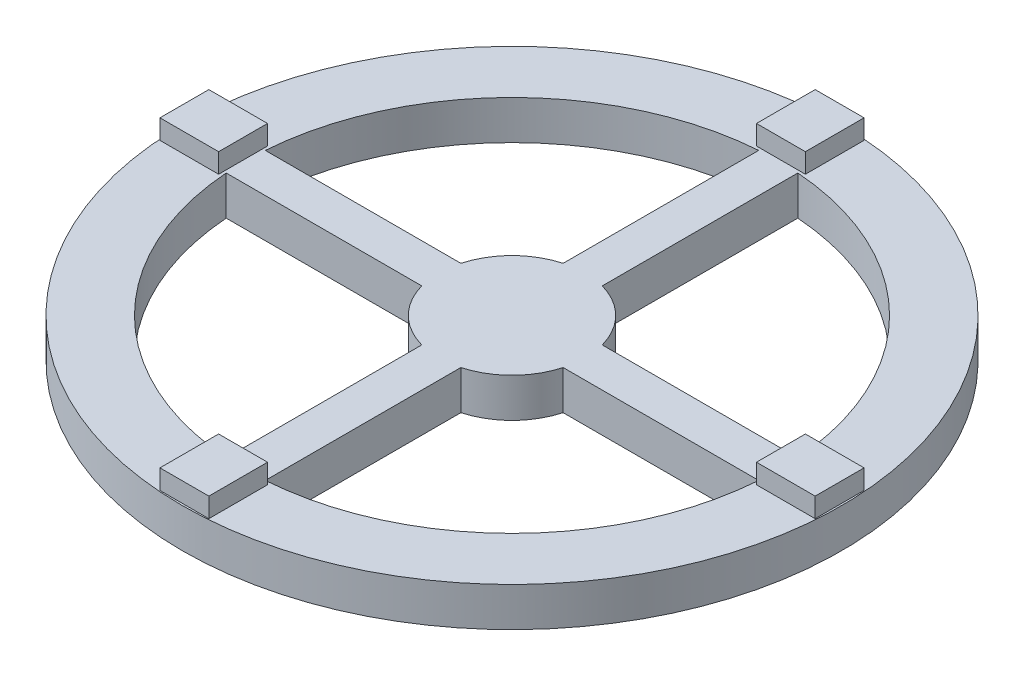
ISO-10303-21;
HEADER;
FILE_DESCRIPTION(('STEP AP214'),'2;1');
FILE_NAME('part.step','',(''),(''),'','','');
FILE_SCHEMA(('AUTOMOTIVE_DESIGN { 1 0 10303 214 1 1 1 1 }'));
ENDSEC;
DATA;
#1=APPLICATION_CONTEXT('core data for automotive mechanical design processes');
#2=APPLICATION_PROTOCOL_DEFINITION('international standard','automotive_design',2000,#1);
#3=PRODUCT_CONTEXT('',#1,'mechanical');
#4=PRODUCT('Part','Part','',(#3));
#5=PRODUCT_RELATED_PRODUCT_CATEGORY('part','',(#4));
#6=PRODUCT_DEFINITION_FORMATION('','',#4);
#7=PRODUCT_DEFINITION_CONTEXT('part definition',#1,'design');
#8=PRODUCT_DEFINITION('design','',#6,#7);
#9=PRODUCT_DEFINITION_SHAPE('','',#8);
#10=(LENGTH_UNIT() NAMED_UNIT(*) SI_UNIT(.MILLI.,.METRE.));
#11=(NAMED_UNIT(*) PLANE_ANGLE_UNIT() SI_UNIT($,.RADIAN.));
#12=(NAMED_UNIT(*) SI_UNIT($,.STERADIAN.) SOLID_ANGLE_UNIT());
#13=UNCERTAINTY_MEASURE_WITH_UNIT(LENGTH_MEASURE(1.E-05),#10,'distance_accuracy_value','');
#14=(GEOMETRIC_REPRESENTATION_CONTEXT(3) GLOBAL_UNCERTAINTY_ASSIGNED_CONTEXT((#13)) GLOBAL_UNIT_ASSIGNED_CONTEXT((#10,
#11,#12)) REPRESENTATION_CONTEXT('',''));
#15=CARTESIAN_POINT('',(0.,0.,0.));
#16=DIRECTION('',(0.,0.,1.));
#17=DIRECTION('',(1.,0.,0.));
#18=AXIS2_PLACEMENT_3D('',#15,#16,#17);
#19=CARTESIAN_POINT('',(-20.,20.,75.));
#20=DIRECTION('',(0.,1.,0.));
#21=DIRECTION('',(0.,0.,1.));
#22=AXIS2_PLACEMENT_3D('',#19,#20,#21);
#23=PLANE('',#22);
#24=CARTESIAN_POINT('',(0.,20.,0.));
#25=DIRECTION('',(0.,1.,0.));
#26=DIRECTION('',(0.,0.,1.));
#27=AXIS2_PLACEMENT_3D('',#24,#25,#26);
#28=CIRCLE('',#27,75.0000000000002);
#29=CARTESIAN_POINT('',(-72.2841614740051,20.,19.9999999999997));
#30=VERTEX_POINT('',#29);
#31=CARTESIAN_POINT('',(-20.,20.,72.284161474005));
#32=VERTEX_POINT('',#31);
#33=EDGE_CURVE('E371',#30,#32,#28,.T.);
#34=ORIENTED_EDGE('',*,*,#33,.T.);
#35=DIRECTION('',(0.,0.,1.));
#36=VECTOR('',#35,1.);
#37=CARTESIAN_POINT('',(-20.,20.,75.));
#38=LINE('',#37,#36);
#39=CARTESIAN_POINT('',(-20.,20.,272.266413646634));
#40=VERTEX_POINT('',#39);
#41=EDGE_CURVE('E480',#32,#40,#38,.T.);
#42=ORIENTED_EDGE('',*,*,#41,.T.);
#43=CARTESIAN_POINT('',(0.,20.,0.));
#44=DIRECTION('',(0.,1.,0.));
#45=DIRECTION('',(0.,0.,1.));
#46=AXIS2_PLACEMENT_3D('',#43,#44,#45);
#47=CIRCLE('',#46,273.);
#48=CARTESIAN_POINT('',(-272.266413646634,20.,19.9999999999991));
#49=VERTEX_POINT('',#48);
#50=EDGE_CURVE('E414',#49,#40,#47,.T.);
#51=ORIENTED_EDGE('',*,*,#50,.F.);
#52=DIRECTION('',(-1.,0.,0.));
#53=VECTOR('',#52,1.);
#54=CARTESIAN_POINT('',(-75.,20.,19.9999999999998));
#55=LINE('',#54,#53);
#56=EDGE_CURVE('E459',#30,#49,#55,.T.);
#57=ORIENTED_EDGE('',*,*,#56,.F.);
#58=EDGE_LOOP('',(#34,#42,#51,#57));
#59=FACE_BOUND('',#58,.T.);
#60=CARTESIAN_POINT('',(0.,20.,0.));
#61=DIRECTION('',(0.,1.,0.));
#62=DIRECTION('',(0.,0.,1.));
#63=AXIS2_PLACEMENT_3D('',#60,#61,#62);
#64=CIRCLE('',#63,75.0000000000002);
#65=CARTESIAN_POINT('',(20.,20.,72.284161474005));
#66=VERTEX_POINT('',#65);
#67=CARTESIAN_POINT('',(72.2841614740048,20.,20.0000000000008));
#68=VERTEX_POINT('',#67);
#69=EDGE_CURVE('E361',#66,#68,#64,.T.);
#70=ORIENTED_EDGE('',*,*,#69,.T.);
#71=DIRECTION('',(1.,0.,0.));
#72=VECTOR('',#71,1.);
#73=CARTESIAN_POINT('',(74.9999999999998,20.,20.0000000000008));
#74=LINE('',#73,#72);
#75=CARTESIAN_POINT('',(272.266413646634,20.,20.0000000000029));
#76=VERTEX_POINT('',#75);
#77=EDGE_CURVE('E452',#68,#76,#74,.T.);
#78=ORIENTED_EDGE('',*,*,#77,.T.);
#79=CARTESIAN_POINT('',(20.,20.,272.266413646634));
#80=VERTEX_POINT('',#79);
#81=EDGE_CURVE('E409',#80,#76,#47,.T.);
#82=ORIENTED_EDGE('',*,*,#81,.F.);
#83=DIRECTION('',(0.,0.,1.));
#84=VECTOR('',#83,1.);
#85=CARTESIAN_POINT('',(20.,20.,75.));
#86=LINE('',#85,#84);
#87=EDGE_CURVE('E469',#66,#80,#86,.T.);
#88=ORIENTED_EDGE('',*,*,#87,.F.);
#89=EDGE_LOOP('',(#70,#78,#82,#88));
#90=FACE_BOUND('',#89,.T.);
#91=CARTESIAN_POINT('',(0.,20.,0.));
#92=DIRECTION('',(0.,1.,0.));
#93=DIRECTION('',(0.,0.,1.));
#94=AXIS2_PLACEMENT_3D('',#91,#92,#93);
#95=CIRCLE('',#94,75.0000000000002);
#96=CARTESIAN_POINT('',(72.2841614740052,20.,-19.9999999999993));
#97=VERTEX_POINT('',#96);
#98=CARTESIAN_POINT('',(20.0000000000005,20.,-72.2841614740049));
#99=VERTEX_POINT('',#98);
#100=EDGE_CURVE('E364',#97,#99,#95,.T.);
#101=ORIENTED_EDGE('',*,*,#100,.T.);
#102=DIRECTION('',(0.,0.,-1.));
#103=VECTOR('',#102,1.);
#104=CARTESIAN_POINT('',(20.,20.,-75.));
#105=LINE('',#104,#103);
#106=CARTESIAN_POINT('',(20.,20.,-272.266413646634));
#107=VERTEX_POINT('',#106);
#108=EDGE_CURVE('E462',#99,#107,#105,.T.);
#109=ORIENTED_EDGE('',*,*,#108,.T.);
#110=CARTESIAN_POINT('',(272.266413646634,20.,-19.9999999999972));
#111=VERTEX_POINT('',#110);
#112=EDGE_CURVE('E413',#111,#107,#47,.T.);
#113=ORIENTED_EDGE('',*,*,#112,.F.);
#114=DIRECTION('',(1.,0.,0.));
#115=VECTOR('',#114,1.);
#116=CARTESIAN_POINT('',(75.0000000000002,20.,-19.9999999999992));
#117=LINE('',#116,#115);
#118=EDGE_CURVE('E445',#97,#111,#117,.T.);
#119=ORIENTED_EDGE('',*,*,#118,.F.);
#120=EDGE_LOOP('',(#101,#109,#113,#119));
#121=FACE_BOUND('',#120,.T.);
#122=DIRECTION('',(0.,0.,-1.));
#123=VECTOR('',#122,1.);
#124=CARTESIAN_POINT('',(-20.,20.,-75.));
#125=LINE('',#124,#123);
#126=CARTESIAN_POINT('',(-19.9999999999995,20.,-72.2841614740052));
#127=VERTEX_POINT('',#126);
#128=CARTESIAN_POINT('',(-20.,20.,-272.266413646634));
#129=VERTEX_POINT('',#128);
#130=EDGE_CURVE('E449',#127,#129,#125,.T.);
#131=ORIENTED_EDGE('',*,*,#130,.F.);
#132=CARTESIAN_POINT('',(0.,20.,0.));
#133=DIRECTION('',(0.,1.,0.));
#134=DIRECTION('',(0.,0.,1.));
#135=AXIS2_PLACEMENT_3D('',#132,#133,#134);
#136=CIRCLE('',#135,75.0000000000002);
#137=CARTESIAN_POINT('',(-72.284161474005,20.,-20.0000000000003));
#138=VERTEX_POINT('',#137);
#139=EDGE_CURVE('E368',#127,#138,#136,.T.);
#140=ORIENTED_EDGE('',*,*,#139,.T.);
#141=DIRECTION('',(-1.,0.,0.));
#142=VECTOR('',#141,1.);
#143=CARTESIAN_POINT('',(-74.9999999999999,20.,-20.0000000000003));
#144=LINE('',#143,#142);
#145=CARTESIAN_POINT('',(-272.266413646634,20.,-20.000000000001));
#146=VERTEX_POINT('',#145);
#147=EDGE_CURVE('E472',#138,#146,#144,.T.);
#148=ORIENTED_EDGE('',*,*,#147,.T.);
#149=EDGE_CURVE('E563',#129,#146,#47,.T.);
#150=ORIENTED_EDGE('',*,*,#149,.F.);
#151=EDGE_LOOP('',(#131,#140,#148,#150));
#152=FACE_BOUND('',#151,.T.);
#153=CARTESIAN_POINT('',(0.,20.,0.));
#154=DIRECTION('',(0.,1.,0.));
#155=DIRECTION('',(0.,0.,1.));
#156=AXIS2_PLACEMENT_3D('',#153,#154,#155);
#157=CIRCLE('',#156,337.);
#158=CARTESIAN_POINT('',(0.,20.,337.));
#159=VERTEX_POINT('',#158);
#160=EDGE_CURVE('E419',#159,#159,#157,.T.);
#161=ORIENTED_EDGE('',*,*,#160,.T.);
#162=EDGE_LOOP('',(#161));
#163=FACE_BOUND('',#162,.T.);
#164=DIRECTION('',(-1.,0.,0.));
#165=VECTOR('',#164,1.);
#166=CARTESIAN_POINT('',(275.,20.,-24.9999999999999));
#167=LINE('',#166,#165);
#168=CARTESIAN_POINT('',(335.,20.,-24.9999999999999));
#169=VERTEX_POINT('',#168);
#170=CARTESIAN_POINT('',(275.,20.,-24.9999999999999));
#171=VERTEX_POINT('',#170);
#172=EDGE_CURVE('E345',#169,#171,#167,.T.);
#173=ORIENTED_EDGE('',*,*,#172,.F.);
#174=DIRECTION('',(0.,0.,-1.));
#175=VECTOR('',#174,1.);
#176=CARTESIAN_POINT('',(335.,20.,25.0000000000001));
#177=LINE('',#176,#175);
#178=CARTESIAN_POINT('',(335.,20.,25.0000000000001));
#179=VERTEX_POINT('',#178);
#180=EDGE_CURVE('E331',#179,#169,#177,.T.);
#181=ORIENTED_EDGE('',*,*,#180,.F.);
#182=DIRECTION('',(1.,0.,0.));
#183=VECTOR('',#182,1.);
#184=CARTESIAN_POINT('',(275.,20.,25.0000000000001));
#185=LINE('',#184,#183);
#186=CARTESIAN_POINT('',(275.,20.,25.0000000000001));
#187=VERTEX_POINT('',#186);
#188=EDGE_CURVE('E336',#187,#179,#185,.T.);
#189=ORIENTED_EDGE('',*,*,#188,.F.);
#190=DIRECTION('',(0.,0.,1.));
#191=VECTOR('',#190,1.);
#192=CARTESIAN_POINT('',(275.,20.,25.0000000000001));
#193=LINE('',#192,#191);
#194=EDGE_CURVE('E347',#171,#187,#193,.T.);
#195=ORIENTED_EDGE('',*,*,#194,.F.);
#196=EDGE_LOOP('',(#173,#181,#189,#195));
#197=FACE_BOUND('',#196,.T.);
#198=DIRECTION('',(-1.,0.,0.));
#199=VECTOR('',#198,1.);
#200=CARTESIAN_POINT('',(-25.,20.,275.));
#201=LINE('',#200,#199);
#202=CARTESIAN_POINT('',(25.,20.,275.));
#203=VERTEX_POINT('',#202);
#204=CARTESIAN_POINT('',(-25.,20.,275.));
#205=VERTEX_POINT('',#204);
#206=EDGE_CURVE('E316',#203,#205,#201,.T.);
#207=ORIENTED_EDGE('',*,*,#206,.F.);
#208=DIRECTION('',(0.,0.,-1.));
#209=VECTOR('',#208,1.);
#210=CARTESIAN_POINT('',(25.,20.,275.));
#211=LINE('',#210,#209);
#212=CARTESIAN_POINT('',(25.,20.,335.));
#213=VERTEX_POINT('',#212);
#214=EDGE_CURVE('E302',#213,#203,#211,.T.);
#215=ORIENTED_EDGE('',*,*,#214,.F.);
#216=DIRECTION('',(1.,0.,0.));
#217=VECTOR('',#216,1.);
#218=CARTESIAN_POINT('',(-25.,20.,335.));
#219=LINE('',#218,#217);
#220=CARTESIAN_POINT('',(-25.,20.,335.));
#221=VERTEX_POINT('',#220);
#222=EDGE_CURVE('E307',#221,#213,#219,.T.);
#223=ORIENTED_EDGE('',*,*,#222,.F.);
#224=DIRECTION('',(0.,0.,1.));
#225=VECTOR('',#224,1.);
#226=CARTESIAN_POINT('',(-25.,20.,275.));
#227=LINE('',#226,#225);
#228=EDGE_CURVE('E318',#205,#221,#227,.T.);
#229=ORIENTED_EDGE('',*,*,#228,.F.);
#230=EDGE_LOOP('',(#207,#215,#223,#229));
#231=FACE_BOUND('',#230,.T.);
#232=DIRECTION('',(0.,0.,-1.));
#233=VECTOR('',#232,1.);
#234=CARTESIAN_POINT('',(-275.,20.,-25.));
#235=LINE('',#234,#233);
#236=CARTESIAN_POINT('',(-275.,20.,25.));
#237=VERTEX_POINT('',#236);
#238=CARTESIAN_POINT('',(-275.,20.,-25.));
#239=VERTEX_POINT('',#238);
#240=EDGE_CURVE('E274',#237,#239,#235,.T.);
#241=ORIENTED_EDGE('',*,*,#240,.F.);
#242=DIRECTION('',(1.,0.,0.));
#243=VECTOR('',#242,1.);
#244=CARTESIAN_POINT('',(-275.,20.,25.));
#245=LINE('',#244,#243);
#246=CARTESIAN_POINT('',(-335.,20.,25.0000000000001));
#247=VERTEX_POINT('',#246);
#248=EDGE_CURVE('E271',#247,#237,#245,.T.);
#249=ORIENTED_EDGE('',*,*,#248,.F.);
#250=DIRECTION('',(0.,0.,1.));
#251=VECTOR('',#250,1.);
#252=CARTESIAN_POINT('',(-335.,20.,-24.9999999999999));
#253=LINE('',#252,#251);
#254=CARTESIAN_POINT('',(-335.,20.,-24.9999999999999));
#255=VERTEX_POINT('',#254);
#256=EDGE_CURVE('E283',#255,#247,#253,.T.);
#257=ORIENTED_EDGE('',*,*,#256,.F.);
#258=DIRECTION('',(-1.,0.,0.));
#259=VECTOR('',#258,1.);
#260=CARTESIAN_POINT('',(-275.,20.,-25.));
#261=LINE('',#260,#259);
#262=EDGE_CURVE('E291',#239,#255,#261,.T.);
#263=ORIENTED_EDGE('',*,*,#262,.F.);
#264=EDGE_LOOP('',(#241,#249,#257,#263));
#265=FACE_BOUND('',#264,.T.);
#266=DIRECTION('',(1.,0.,0.));
#267=VECTOR('',#266,1.);
#268=CARTESIAN_POINT('',(25.0000000000001,20.,-275.));
#269=LINE('',#268,#267);
#270=CARTESIAN_POINT('',(-25.,20.,-275.));
#271=VERTEX_POINT('',#270);
#272=CARTESIAN_POINT('',(25.0000000000001,20.,-275.));
#273=VERTEX_POINT('',#272);
#274=EDGE_CURVE('E605',#271,#273,#269,.T.);
#275=ORIENTED_EDGE('',*,*,#274,.F.);
#276=DIRECTION('',(0.,0.,1.));
#277=VECTOR('',#276,1.);
#278=CARTESIAN_POINT('',(-25.,20.,-275.));
#279=LINE('',#278,#277);
#280=CARTESIAN_POINT('',(-25.0000000000001,20.,-335.));
#281=VERTEX_POINT('',#280);
#282=EDGE_CURVE('E269',#281,#271,#279,.T.);
#283=ORIENTED_EDGE('',*,*,#282,.F.);
#284=DIRECTION('',(-1.,0.,0.));
#285=VECTOR('',#284,1.);
#286=CARTESIAN_POINT('',(25.,20.,-335.));
#287=LINE('',#286,#285);
#288=CARTESIAN_POINT('',(25.,20.,-335.));
#289=VERTEX_POINT('',#288);
#290=EDGE_CURVE('E265',#289,#281,#287,.T.);
#291=ORIENTED_EDGE('',*,*,#290,.F.);
#292=DIRECTION('',(0.,0.,-1.));
#293=VECTOR('',#292,1.);
#294=CARTESIAN_POINT('',(25.0000000000001,20.,-275.));
#295=LINE('',#294,#293);
#296=EDGE_CURVE('E607',#273,#289,#295,.T.);
#297=ORIENTED_EDGE('',*,*,#296,.F.);
#298=EDGE_LOOP('',(#275,#283,#291,#297));
#299=FACE_BOUND('',#298,.T.);
#300=ADVANCED_FACE('F36',(#59,#90,#121,#152,#163,#197,#231,#265,#299),#23,.T.);
#301=CARTESIAN_POINT('',(-20.,-20.,75.));
#302=DIRECTION('',(0.,-1.,0.));
#303=DIRECTION('',(0.,0.,-1.));
#304=AXIS2_PLACEMENT_3D('',#301,#302,#303);
#305=PLANE('',#304);
#306=CARTESIAN_POINT('',(0.,-20.,0.));
#307=DIRECTION('',(0.,1.,0.));
#308=DIRECTION('',(0.,0.,1.));
#309=AXIS2_PLACEMENT_3D('',#306,#307,#308);
#310=CIRCLE('',#309,75.0000000000002);
#311=CARTESIAN_POINT('',(20.,-20.,72.284161474005));
#312=VERTEX_POINT('',#311);
#313=CARTESIAN_POINT('',(72.2841614740048,-20.,20.0000000000008));
#314=VERTEX_POINT('',#313);
#315=EDGE_CURVE('E360',#312,#314,#310,.T.);
#316=ORIENTED_EDGE('',*,*,#315,.F.);
#317=DIRECTION('',(0.,0.,1.));
#318=VECTOR('',#317,1.);
#319=CARTESIAN_POINT('',(20.,-20.,75.));
#320=LINE('',#319,#318);
#321=CARTESIAN_POINT('',(20.,-20.,272.266413646634));
#322=VERTEX_POINT('',#321);
#323=EDGE_CURVE('E44',#312,#322,#320,.T.);
#324=ORIENTED_EDGE('',*,*,#323,.T.);
#325=CARTESIAN_POINT('',(0.,-20.,0.));
#326=DIRECTION('',(0.,1.,0.));
#327=DIRECTION('',(0.,0.,1.));
#328=AXIS2_PLACEMENT_3D('',#325,#326,#327);
#329=CIRCLE('',#328,273.);
#330=CARTESIAN_POINT('',(272.266413646634,-20.,20.0000000000029));
#331=VERTEX_POINT('',#330);
#332=EDGE_CURVE('E415',#322,#331,#329,.T.);
#333=ORIENTED_EDGE('',*,*,#332,.T.);
#334=DIRECTION('',(1.,0.,0.));
#335=VECTOR('',#334,1.);
#336=CARTESIAN_POINT('',(74.9999999999998,-20.,20.0000000000008));
#337=LINE('',#336,#335);
#338=EDGE_CURVE('E450',#314,#331,#337,.T.);
#339=ORIENTED_EDGE('',*,*,#338,.F.);
#340=EDGE_LOOP('',(#316,#324,#333,#339));
#341=FACE_BOUND('',#340,.T.);
#342=CARTESIAN_POINT('',(0.,-20.,0.));
#343=DIRECTION('',(0.,1.,0.));
#344=DIRECTION('',(0.,0.,1.));
#345=AXIS2_PLACEMENT_3D('',#342,#343,#344);
#346=CIRCLE('',#345,75.0000000000002);
#347=CARTESIAN_POINT('',(72.2841614740052,-20.,-19.9999999999993));
#348=VERTEX_POINT('',#347);
#349=CARTESIAN_POINT('',(20.0000000000005,-20.,-72.2841614740049));
#350=VERTEX_POINT('',#349);
#351=EDGE_CURVE('E377',#348,#350,#346,.T.);
#352=ORIENTED_EDGE('',*,*,#351,.F.);
#353=DIRECTION('',(1.,0.,0.));
#354=VECTOR('',#353,1.);
#355=CARTESIAN_POINT('',(75.0000000000002,-20.,-19.9999999999992));
#356=LINE('',#355,#354);
#357=CARTESIAN_POINT('',(272.266413646634,-20.,-19.9999999999972));
#358=VERTEX_POINT('',#357);
#359=EDGE_CURVE('E446',#348,#358,#356,.T.);
#360=ORIENTED_EDGE('',*,*,#359,.T.);
#361=CARTESIAN_POINT('',(20.,-20.,-272.266413646634));
#362=VERTEX_POINT('',#361);
#363=EDGE_CURVE('E418',#358,#362,#329,.T.);
#364=ORIENTED_EDGE('',*,*,#363,.T.);
#365=DIRECTION('',(0.,0.,-1.));
#366=VECTOR('',#365,1.);
#367=CARTESIAN_POINT('',(20.,-20.,-75.));
#368=LINE('',#367,#366);
#369=EDGE_CURVE('E460',#350,#362,#368,.T.);
#370=ORIENTED_EDGE('',*,*,#369,.F.);
#371=EDGE_LOOP('',(#352,#360,#364,#370));
#372=FACE_BOUND('',#371,.T.);
#373=CARTESIAN_POINT('',(0.,-20.,0.));
#374=DIRECTION('',(0.,1.,0.));
#375=DIRECTION('',(0.,0.,1.));
#376=AXIS2_PLACEMENT_3D('',#373,#374,#375);
#377=CIRCLE('',#376,75.0000000000002);
#378=CARTESIAN_POINT('',(-19.9999999999995,-20.,-72.2841614740052));
#379=VERTEX_POINT('',#378);
#380=CARTESIAN_POINT('',(-72.284161474005,-20.,-20.0000000000003));
#381=VERTEX_POINT('',#380);
#382=EDGE_CURVE('E380',#379,#381,#377,.T.);
#383=ORIENTED_EDGE('',*,*,#382,.F.);
#384=DIRECTION('',(0.,0.,-1.));
#385=VECTOR('',#384,1.);
#386=CARTESIAN_POINT('',(-20.,-20.,-75.));
#387=LINE('',#386,#385);
#388=CARTESIAN_POINT('',(-20.,-20.,-272.266413646634));
#389=VERTEX_POINT('',#388);
#390=EDGE_CURVE('E456',#379,#389,#387,.T.);
#391=ORIENTED_EDGE('',*,*,#390,.T.);
#392=CARTESIAN_POINT('',(-272.266413646634,-20.,-20.000000000001));
#393=VERTEX_POINT('',#392);
#394=EDGE_CURVE('E579',#389,#393,#329,.T.);
#395=ORIENTED_EDGE('',*,*,#394,.T.);
#396=DIRECTION('',(-1.,0.,0.));
#397=VECTOR('',#396,1.);
#398=CARTESIAN_POINT('',(-74.9999999999999,-20.,-20.0000000000003));
#399=LINE('',#398,#397);
#400=EDGE_CURVE('E470',#381,#393,#399,.T.);
#401=ORIENTED_EDGE('',*,*,#400,.F.);
#402=EDGE_LOOP('',(#383,#391,#395,#401));
#403=FACE_BOUND('',#402,.T.);
#404=CARTESIAN_POINT('',(-272.266413646634,-20.,19.9999999999991));
#405=VERTEX_POINT('',#404);
#406=CARTESIAN_POINT('',(-20.,-20.,272.266413646634));
#407=VERTEX_POINT('',#406);
#408=EDGE_CURVE('E408',#405,#407,#329,.T.);
#409=ORIENTED_EDGE('',*,*,#408,.T.);
#410=DIRECTION('',(0.,0.,1.));
#411=VECTOR('',#410,1.);
#412=CARTESIAN_POINT('',(-20.,-20.,75.));
#413=LINE('',#412,#411);
#414=CARTESIAN_POINT('',(-20.,-20.,72.284161474005));
#415=VERTEX_POINT('',#414);
#416=EDGE_CURVE('E478',#415,#407,#413,.T.);
#417=ORIENTED_EDGE('',*,*,#416,.F.);
#418=CARTESIAN_POINT('',(0.,-20.,0.));
#419=DIRECTION('',(0.,1.,0.));
#420=DIRECTION('',(0.,0.,1.));
#421=AXIS2_PLACEMENT_3D('',#418,#419,#420);
#422=CIRCLE('',#421,75.0000000000002);
#423=CARTESIAN_POINT('',(-72.2841614740051,-20.,19.9999999999997));
#424=VERTEX_POINT('',#423);
#425=EDGE_CURVE('E365',#424,#415,#422,.T.);
#426=ORIENTED_EDGE('',*,*,#425,.F.);
#427=DIRECTION('',(-1.,0.,0.));
#428=VECTOR('',#427,1.);
#429=CARTESIAN_POINT('',(-75.,-20.,19.9999999999998));
#430=LINE('',#429,#428);
#431=EDGE_CURVE('E466',#424,#405,#430,.T.);
#432=ORIENTED_EDGE('',*,*,#431,.T.);
#433=EDGE_LOOP('',(#409,#417,#426,#432));
#434=FACE_BOUND('',#433,.T.);
#435=CARTESIAN_POINT('',(0.,-20.,0.));
#436=DIRECTION('',(0.,1.,0.));
#437=DIRECTION('',(0.,0.,1.));
#438=AXIS2_PLACEMENT_3D('',#435,#436,#437);
#439=CIRCLE('',#438,337.);
#440=CARTESIAN_POINT('',(0.,-20.,337.));
#441=VERTEX_POINT('',#440);
#442=EDGE_CURVE('E412',#441,#441,#439,.T.);
#443=ORIENTED_EDGE('',*,*,#442,.F.);
#444=EDGE_LOOP('',(#443));
#445=FACE_BOUND('',#444,.T.);
#446=ADVANCED_FACE('F496',(#341,#372,#403,#434,#445),#305,.T.);
#447=CARTESIAN_POINT('',(20.,-20.,75.));
#448=DIRECTION('',(1.,0.,0.));
#449=DIRECTION('',(0.,0.,-1.));
#450=AXIS2_PLACEMENT_3D('',#447,#448,#449);
#451=PLANE('',#450);
#452=DIRECTION('',(0.,-1.,0.));
#453=VECTOR('',#452,1.);
#454=CARTESIAN_POINT('',(20.,20.,272.266413646634));
#455=LINE('',#454,#453);
#456=EDGE_CURVE('E442',#322,#80,#455,.F.);
#457=ORIENTED_EDGE('',*,*,#456,.F.);
#458=ORIENTED_EDGE('',*,*,#323,.F.);
#459=DIRECTION('',(0.,-1.,0.));
#460=VECTOR('',#459,1.);
#461=CARTESIAN_POINT('',(20.,20.,72.284161474005));
#462=LINE('',#461,#460);
#463=EDGE_CURVE('E405',#66,#312,#462,.T.);
#464=ORIENTED_EDGE('',*,*,#463,.F.);
#465=ORIENTED_EDGE('',*,*,#87,.T.);
#466=EDGE_LOOP('',(#457,#458,#464,#465));
#467=FACE_BOUND('',#466,.T.);
#468=ADVANCED_FACE('F38',(#467),#451,.T.);
#469=CARTESIAN_POINT('',(-20.,-20.,75.));
#470=DIRECTION('',(-1.,0.,0.));
#471=DIRECTION('',(0.,0.,1.));
#472=AXIS2_PLACEMENT_3D('',#469,#470,#471);
#473=PLANE('',#472);
#474=DIRECTION('',(0.,-1.,0.));
#475=VECTOR('',#474,1.);
#476=CARTESIAN_POINT('',(-20.,20.,272.266413646634));
#477=LINE('',#476,#475);
#478=EDGE_CURVE('E439',#40,#407,#477,.T.);
#479=ORIENTED_EDGE('',*,*,#478,.F.);
#480=ORIENTED_EDGE('',*,*,#41,.F.);
#481=DIRECTION('',(0.,-1.,0.));
#482=VECTOR('',#481,1.);
#483=CARTESIAN_POINT('',(-20.,20.,72.284161474005));
#484=LINE('',#483,#482);
#485=EDGE_CURVE('E374',#32,#415,#484,.T.);
#486=ORIENTED_EDGE('',*,*,#485,.T.);
#487=ORIENTED_EDGE('',*,*,#416,.T.);
#488=EDGE_LOOP('',(#479,#480,#486,#487));
#489=FACE_BOUND('',#488,.T.);
#490=ADVANCED_FACE('F522',(#489),#473,.T.);
#491=CARTESIAN_POINT('',(0.,20.,0.));
#492=DIRECTION('',(0.,-1.,0.));
#493=DIRECTION('',(0.,0.,-1.));
#494=AXIS2_PLACEMENT_3D('',#491,#492,#493);
#495=CYLINDRICAL_SURFACE('',#494,273.);
#496=ORIENTED_EDGE('',*,*,#332,.F.);
#497=ORIENTED_EDGE('',*,*,#456,.T.);
#498=ORIENTED_EDGE('',*,*,#81,.T.);
#499=DIRECTION('',(0.,-1.,0.));
#500=VECTOR('',#499,1.);
#501=CARTESIAN_POINT('',(272.266413646634,20.,20.0000000000029));
#502=LINE('',#501,#500);
#503=EDGE_CURVE('E11',#76,#331,#502,.T.);
#504=ORIENTED_EDGE('',*,*,#503,.T.);
#505=EDGE_LOOP('',(#496,#497,#498,#504));
#506=FACE_BOUND('',#505,.T.);
#507=ADVANCED_FACE('F489',(#506),#495,.F.);
#508=ORIENTED_EDGE('',*,*,#50,.T.);
#509=ORIENTED_EDGE('',*,*,#478,.T.);
#510=ORIENTED_EDGE('',*,*,#408,.F.);
#511=DIRECTION('',(0.,-1.,0.));
#512=VECTOR('',#511,1.);
#513=CARTESIAN_POINT('',(-272.266413646634,20.,19.9999999999991));
#514=LINE('',#513,#512);
#515=EDGE_CURVE('E436',#405,#49,#514,.F.);
#516=ORIENTED_EDGE('',*,*,#515,.T.);
#517=EDGE_LOOP('',(#508,#509,#510,#516));
#518=FACE_BOUND('',#517,.T.);
#519=ADVANCED_FACE('F554',(#518),#495,.F.);
#520=ORIENTED_EDGE('',*,*,#149,.T.);
#521=DIRECTION('',(0.,-1.,0.));
#522=VECTOR('',#521,1.);
#523=CARTESIAN_POINT('',(-272.266413646634,20.,-20.000000000001));
#524=LINE('',#523,#522);
#525=EDGE_CURVE('E433',#146,#393,#524,.T.);
#526=ORIENTED_EDGE('',*,*,#525,.T.);
#527=ORIENTED_EDGE('',*,*,#394,.F.);
#528=DIRECTION('',(0.,-1.,0.));
#529=VECTOR('',#528,1.);
#530=CARTESIAN_POINT('',(-20.,20.,-272.266413646634));
#531=LINE('',#530,#529);
#532=EDGE_CURVE('E430',#389,#129,#531,.F.);
#533=ORIENTED_EDGE('',*,*,#532,.T.);
#534=EDGE_LOOP('',(#520,#526,#527,#533));
#535=FACE_BOUND('',#534,.T.);
#536=ADVANCED_FACE('F546',(#535),#495,.F.);
#537=CARTESIAN_POINT('',(0.,20.,0.));
#538=DIRECTION('',(0.,-1.,0.));
#539=DIRECTION('',(0.,0.,-1.));
#540=AXIS2_PLACEMENT_3D('',#537,#538,#539);
#541=CYLINDRICAL_SURFACE('',#540,337.);
#542=ORIENTED_EDGE('',*,*,#160,.F.);
#543=EDGE_LOOP('',(#542));
#544=FACE_BOUND('',#543,.T.);
#545=ORIENTED_EDGE('',*,*,#442,.T.);
#546=EDGE_LOOP('',(#545));
#547=FACE_BOUND('',#546,.T.);
#548=ADVANCED_FACE('F544',(#544,#547),#541,.T.);
#549=ORIENTED_EDGE('',*,*,#112,.T.);
#550=DIRECTION('',(0.,-1.,0.));
#551=VECTOR('',#550,1.);
#552=CARTESIAN_POINT('',(20.,20.,-272.266413646634));
#553=LINE('',#552,#551);
#554=EDGE_CURVE('E427',#107,#362,#553,.T.);
#555=ORIENTED_EDGE('',*,*,#554,.T.);
#556=ORIENTED_EDGE('',*,*,#363,.F.);
#557=DIRECTION('',(0.,-1.,0.));
#558=VECTOR('',#557,1.);
#559=CARTESIAN_POINT('',(272.266413646634,20.,-19.9999999999972));
#560=LINE('',#559,#558);
#561=EDGE_CURVE('E422',#358,#111,#560,.F.);
#562=ORIENTED_EDGE('',*,*,#561,.T.);
#563=EDGE_LOOP('',(#549,#555,#556,#562));
#564=FACE_BOUND('',#563,.T.);
#565=ADVANCED_FACE('F543',(#564),#495,.F.);
#566=CARTESIAN_POINT('',(74.9999999999998,-20.,20.0000000000008));
#567=DIRECTION('',(0.,0.,1.));
#568=DIRECTION('',(1.,0.,0.));
#569=AXIS2_PLACEMENT_3D('',#566,#567,#568);
#570=PLANE('',#569);
#571=ORIENTED_EDGE('',*,*,#503,.F.);
#572=ORIENTED_EDGE('',*,*,#77,.F.);
#573=DIRECTION('',(0.,-1.,0.));
#574=VECTOR('',#573,1.);
#575=CARTESIAN_POINT('',(72.2841614740048,20.,20.0000000000008));
#576=LINE('',#575,#574);
#577=EDGE_CURVE('E402',#68,#314,#576,.T.);
#578=ORIENTED_EDGE('',*,*,#577,.T.);
#579=ORIENTED_EDGE('',*,*,#338,.T.);
#580=EDGE_LOOP('',(#571,#572,#578,#579));
#581=FACE_BOUND('',#580,.T.);
#582=ADVANCED_FACE('F493',(#581),#570,.T.);
#583=CARTESIAN_POINT('',(75.0000000000002,-20.,-19.9999999999992));
#584=DIRECTION('',(0.,0.,-1.));
#585=DIRECTION('',(-1.,0.,0.));
#586=AXIS2_PLACEMENT_3D('',#583,#584,#585);
#587=PLANE('',#586);
#588=ORIENTED_EDGE('',*,*,#561,.F.);
#589=ORIENTED_EDGE('',*,*,#359,.F.);
#590=DIRECTION('',(0.,-1.,0.));
#591=VECTOR('',#590,1.);
#592=CARTESIAN_POINT('',(72.2841614740052,20.,-19.9999999999993));
#593=LINE('',#592,#591);
#594=EDGE_CURVE('E399',#97,#348,#593,.T.);
#595=ORIENTED_EDGE('',*,*,#594,.F.);
#596=ORIENTED_EDGE('',*,*,#118,.T.);
#597=EDGE_LOOP('',(#588,#589,#595,#596));
#598=FACE_BOUND('',#597,.T.);
#599=ADVANCED_FACE('F536',(#598),#587,.T.);
#600=CARTESIAN_POINT('',(20.,-20.,-75.));
#601=DIRECTION('',(1.,0.,0.));
#602=DIRECTION('',(0.,0.,-1.));
#603=AXIS2_PLACEMENT_3D('',#600,#601,#602);
#604=PLANE('',#603);
#605=ORIENTED_EDGE('',*,*,#554,.F.);
#606=ORIENTED_EDGE('',*,*,#108,.F.);
#607=DIRECTION('',(0.,-1.,0.));
#608=VECTOR('',#607,1.);
#609=CARTESIAN_POINT('',(20.0000000000005,20.,-72.2841614740049));
#610=LINE('',#609,#608);
#611=EDGE_CURVE('E396',#99,#350,#610,.T.);
#612=ORIENTED_EDGE('',*,*,#611,.T.);
#613=ORIENTED_EDGE('',*,*,#369,.T.);
#614=EDGE_LOOP('',(#605,#606,#612,#613));
#615=FACE_BOUND('',#614,.T.);
#616=ADVANCED_FACE('F532',(#615),#604,.T.);
#617=CARTESIAN_POINT('',(-20.,-20.,-75.));
#618=DIRECTION('',(-1.,0.,0.));
#619=DIRECTION('',(0.,0.,1.));
#620=AXIS2_PLACEMENT_3D('',#617,#618,#619);
#621=PLANE('',#620);
#622=ORIENTED_EDGE('',*,*,#532,.F.);
#623=ORIENTED_EDGE('',*,*,#390,.F.);
#624=DIRECTION('',(0.,-1.,0.));
#625=VECTOR('',#624,1.);
#626=CARTESIAN_POINT('',(-19.9999999999995,20.,-72.2841614740052));
#627=LINE('',#626,#625);
#628=EDGE_CURVE('E393',#127,#379,#627,.T.);
#629=ORIENTED_EDGE('',*,*,#628,.F.);
#630=ORIENTED_EDGE('',*,*,#130,.T.);
#631=EDGE_LOOP('',(#622,#623,#629,#630));
#632=FACE_BOUND('',#631,.T.);
#633=ADVANCED_FACE('F527',(#632),#621,.T.);
#634=CARTESIAN_POINT('',(-75.,-20.,19.9999999999998));
#635=DIRECTION('',(0.,0.,1.));
#636=DIRECTION('',(1.,0.,0.));
#637=AXIS2_PLACEMENT_3D('',#634,#635,#636);
#638=PLANE('',#637);
#639=ORIENTED_EDGE('',*,*,#515,.F.);
#640=ORIENTED_EDGE('',*,*,#431,.F.);
#641=DIRECTION('',(0.,-1.,0.));
#642=VECTOR('',#641,1.);
#643=CARTESIAN_POINT('',(-72.2841614740051,20.,19.9999999999997));
#644=LINE('',#643,#642);
#645=EDGE_CURVE('E387',#30,#424,#644,.T.);
#646=ORIENTED_EDGE('',*,*,#645,.F.);
#647=ORIENTED_EDGE('',*,*,#56,.T.);
#648=EDGE_LOOP('',(#639,#640,#646,#647));
#649=FACE_BOUND('',#648,.T.);
#650=ADVANCED_FACE('F511',(#649),#638,.T.);
#651=CARTESIAN_POINT('',(-74.9999999999999,-20.,-20.0000000000003));
#652=DIRECTION('',(0.,0.,-1.));
#653=DIRECTION('',(-1.,0.,0.));
#654=AXIS2_PLACEMENT_3D('',#651,#652,#653);
#655=PLANE('',#654);
#656=ORIENTED_EDGE('',*,*,#525,.F.);
#657=ORIENTED_EDGE('',*,*,#147,.F.);
#658=DIRECTION('',(0.,-1.,0.));
#659=VECTOR('',#658,1.);
#660=CARTESIAN_POINT('',(-72.284161474005,20.,-20.0000000000003));
#661=LINE('',#660,#659);
#662=EDGE_CURVE('E390',#138,#381,#661,.T.);
#663=ORIENTED_EDGE('',*,*,#662,.T.);
#664=ORIENTED_EDGE('',*,*,#400,.T.);
#665=EDGE_LOOP('',(#656,#657,#663,#664));
#666=FACE_BOUND('',#665,.T.);
#667=ADVANCED_FACE('F502',(#666),#655,.T.);
#668=CARTESIAN_POINT('',(0.,20.,0.));
#669=DIRECTION('',(0.,-1.,0.));
#670=DIRECTION('',(0.,0.,-1.));
#671=AXIS2_PLACEMENT_3D('',#668,#669,#670);
#672=CYLINDRICAL_SURFACE('',#671,75.0000000000002);
#673=ORIENTED_EDGE('',*,*,#315,.T.);
#674=ORIENTED_EDGE('',*,*,#577,.F.);
#675=ORIENTED_EDGE('',*,*,#69,.F.);
#676=ORIENTED_EDGE('',*,*,#463,.T.);
#677=EDGE_LOOP('',(#673,#674,#675,#676));
#678=FACE_BOUND('',#677,.T.);
#679=ADVANCED_FACE('F499',(#678),#672,.T.);
#680=CARTESIAN_POINT('',(0.,20.,0.));
#681=DIRECTION('',(0.,-1.,0.));
#682=DIRECTION('',(0.,0.,-1.));
#683=AXIS2_PLACEMENT_3D('',#680,#681,#682);
#684=CYLINDRICAL_SURFACE('',#683,75.0000000000002);
#685=ORIENTED_EDGE('',*,*,#351,.T.);
#686=ORIENTED_EDGE('',*,*,#611,.F.);
#687=ORIENTED_EDGE('',*,*,#100,.F.);
#688=ORIENTED_EDGE('',*,*,#594,.T.);
#689=EDGE_LOOP('',(#685,#686,#687,#688));
#690=FACE_BOUND('',#689,.T.);
#691=ADVANCED_FACE('F501',(#690),#684,.T.);
#692=CARTESIAN_POINT('',(0.,20.,0.));
#693=DIRECTION('',(0.,-1.,0.));
#694=DIRECTION('',(0.,0.,-1.));
#695=AXIS2_PLACEMENT_3D('',#692,#693,#694);
#696=CYLINDRICAL_SURFACE('',#695,75.0000000000002);
#697=ORIENTED_EDGE('',*,*,#382,.T.);
#698=ORIENTED_EDGE('',*,*,#662,.F.);
#699=ORIENTED_EDGE('',*,*,#139,.F.);
#700=ORIENTED_EDGE('',*,*,#628,.T.);
#701=EDGE_LOOP('',(#697,#698,#699,#700));
#702=FACE_BOUND('',#701,.T.);
#703=ADVANCED_FACE('F508',(#702),#696,.T.);
#704=CARTESIAN_POINT('',(0.,20.,0.));
#705=DIRECTION('',(0.,-1.,0.));
#706=DIRECTION('',(0.,0.,-1.));
#707=AXIS2_PLACEMENT_3D('',#704,#705,#706);
#708=CYLINDRICAL_SURFACE('',#707,75.0000000000002);
#709=ORIENTED_EDGE('',*,*,#425,.T.);
#710=ORIENTED_EDGE('',*,*,#485,.F.);
#711=ORIENTED_EDGE('',*,*,#33,.F.);
#712=ORIENTED_EDGE('',*,*,#645,.T.);
#713=EDGE_LOOP('',(#709,#710,#711,#712));
#714=FACE_BOUND('',#713,.T.);
#715=ADVANCED_FACE('F578',(#714),#708,.T.);
#716=CARTESIAN_POINT('',(335.,40.,25.0000000000001));
#717=DIRECTION('',(-1.,0.,0.));
#718=DIRECTION('',(0.,0.,1.));
#719=AXIS2_PLACEMENT_3D('',#716,#717,#718);
#720=PLANE('',#719);
#721=ORIENTED_EDGE('',*,*,#180,.T.);
#722=DIRECTION('',(0.,-1.,0.));
#723=VECTOR('',#722,1.);
#724=CARTESIAN_POINT('',(335.,40.,-24.9999999999999));
#725=LINE('',#724,#723);
#726=CARTESIAN_POINT('',(335.,40.,-24.9999999999999));
#727=VERTEX_POINT('',#726);
#728=EDGE_CURVE('E358',#727,#169,#725,.T.);
#729=ORIENTED_EDGE('',*,*,#728,.F.);
#730=DIRECTION('',(0.,0.,-1.));
#731=VECTOR('',#730,1.);
#732=CARTESIAN_POINT('',(335.,40.,25.0000000000001));
#733=LINE('',#732,#731);
#734=CARTESIAN_POINT('',(335.,40.,25.0000000000001));
#735=VERTEX_POINT('',#734);
#736=EDGE_CURVE('E332',#735,#727,#733,.T.);
#737=ORIENTED_EDGE('',*,*,#736,.F.);
#738=DIRECTION('',(0.,-1.,0.));
#739=VECTOR('',#738,1.);
#740=CARTESIAN_POINT('',(335.,40.,25.0000000000001));
#741=LINE('',#740,#739);
#742=EDGE_CURVE('E342',#735,#179,#741,.T.);
#743=ORIENTED_EDGE('',*,*,#742,.T.);
#744=EDGE_LOOP('',(#721,#729,#737,#743));
#745=FACE_BOUND('',#744,.T.);
#746=ADVANCED_FACE('F686',(#745),#720,.F.);
#747=CARTESIAN_POINT('',(275.,40.,-24.9999999999999));
#748=DIRECTION('',(0.,0.,1.));
#749=DIRECTION('',(1.,0.,0.));
#750=AXIS2_PLACEMENT_3D('',#747,#748,#749);
#751=PLANE('',#750);
#752=ORIENTED_EDGE('',*,*,#172,.T.);
#753=DIRECTION('',(0.,-1.,0.));
#754=VECTOR('',#753,1.);
#755=CARTESIAN_POINT('',(275.,40.,-24.9999999999999));
#756=LINE('',#755,#754);
#757=CARTESIAN_POINT('',(275.,40.,-24.9999999999999));
#758=VERTEX_POINT('',#757);
#759=EDGE_CURVE('E355',#758,#171,#756,.T.);
#760=ORIENTED_EDGE('',*,*,#759,.F.);
#761=DIRECTION('',(-1.,0.,0.));
#762=VECTOR('',#761,1.);
#763=CARTESIAN_POINT('',(275.,40.,-24.9999999999999));
#764=LINE('',#763,#762);
#765=EDGE_CURVE('E335',#727,#758,#764,.T.);
#766=ORIENTED_EDGE('',*,*,#765,.F.);
#767=ORIENTED_EDGE('',*,*,#728,.T.);
#768=EDGE_LOOP('',(#752,#760,#766,#767));
#769=FACE_BOUND('',#768,.T.);
#770=ADVANCED_FACE('F682',(#769),#751,.F.);
#771=CARTESIAN_POINT('',(275.,40.,25.0000000000001));
#772=DIRECTION('',(1.,0.,0.));
#773=DIRECTION('',(0.,0.,-1.));
#774=AXIS2_PLACEMENT_3D('',#771,#772,#773);
#775=PLANE('',#774);
#776=ORIENTED_EDGE('',*,*,#194,.T.);
#777=DIRECTION('',(0.,-1.,0.));
#778=VECTOR('',#777,1.);
#779=CARTESIAN_POINT('',(275.,40.,25.0000000000001));
#780=LINE('',#779,#778);
#781=CARTESIAN_POINT('',(275.,40.,25.0000000000001));
#782=VERTEX_POINT('',#781);
#783=EDGE_CURVE('E353',#782,#187,#780,.T.);
#784=ORIENTED_EDGE('',*,*,#783,.F.);
#785=DIRECTION('',(0.,0.,1.));
#786=VECTOR('',#785,1.);
#787=CARTESIAN_POINT('',(275.,40.,25.0000000000001));
#788=LINE('',#787,#786);
#789=EDGE_CURVE('E338',#758,#782,#788,.T.);
#790=ORIENTED_EDGE('',*,*,#789,.F.);
#791=ORIENTED_EDGE('',*,*,#759,.T.);
#792=EDGE_LOOP('',(#776,#784,#790,#791));
#793=FACE_BOUND('',#792,.T.);
#794=ADVANCED_FACE('F678',(#793),#775,.F.);
#795=CARTESIAN_POINT('',(275.,40.,25.0000000000001));
#796=DIRECTION('',(0.,0.,-1.));
#797=DIRECTION('',(-1.,0.,0.));
#798=AXIS2_PLACEMENT_3D('',#795,#796,#797);
#799=PLANE('',#798);
#800=ORIENTED_EDGE('',*,*,#188,.T.);
#801=ORIENTED_EDGE('',*,*,#742,.F.);
#802=DIRECTION('',(1.,0.,0.));
#803=VECTOR('',#802,1.);
#804=CARTESIAN_POINT('',(275.,40.,25.0000000000001));
#805=LINE('',#804,#803);
#806=EDGE_CURVE('E340',#782,#735,#805,.T.);
#807=ORIENTED_EDGE('',*,*,#806,.F.);
#808=ORIENTED_EDGE('',*,*,#783,.T.);
#809=EDGE_LOOP('',(#800,#801,#807,#808));
#810=FACE_BOUND('',#809,.T.);
#811=ADVANCED_FACE('F674',(#810),#799,.F.);
#812=CARTESIAN_POINT('',(0.,40.,0.));
#813=DIRECTION('',(0.,-1.,0.));
#814=DIRECTION('',(0.,0.,-1.));
#815=AXIS2_PLACEMENT_3D('',#812,#813,#814);
#816=PLANE('',#815);
#817=ORIENTED_EDGE('',*,*,#736,.T.);
#818=ORIENTED_EDGE('',*,*,#765,.T.);
#819=ORIENTED_EDGE('',*,*,#789,.T.);
#820=ORIENTED_EDGE('',*,*,#806,.T.);
#821=EDGE_LOOP('',(#817,#818,#819,#820));
#822=FACE_BOUND('',#821,.T.);
#823=ADVANCED_FACE('F670',(#822),#816,.F.);
#824=CARTESIAN_POINT('',(25.,40.,275.));
#825=DIRECTION('',(-1.,0.,0.));
#826=DIRECTION('',(0.,0.,1.));
#827=AXIS2_PLACEMENT_3D('',#824,#825,#826);
#828=PLANE('',#827);
#829=ORIENTED_EDGE('',*,*,#214,.T.);
#830=DIRECTION('',(0.,-1.,0.));
#831=VECTOR('',#830,1.);
#832=CARTESIAN_POINT('',(25.,40.,275.));
#833=LINE('',#832,#831);
#834=CARTESIAN_POINT('',(25.,40.,275.));
#835=VERTEX_POINT('',#834);
#836=EDGE_CURVE('E329',#835,#203,#833,.T.);
#837=ORIENTED_EDGE('',*,*,#836,.F.);
#838=DIRECTION('',(0.,0.,-1.));
#839=VECTOR('',#838,1.);
#840=CARTESIAN_POINT('',(25.,40.,275.));
#841=LINE('',#840,#839);
#842=CARTESIAN_POINT('',(25.,40.,335.));
#843=VERTEX_POINT('',#842);
#844=EDGE_CURVE('E303',#843,#835,#841,.T.);
#845=ORIENTED_EDGE('',*,*,#844,.F.);
#846=DIRECTION('',(0.,-1.,0.));
#847=VECTOR('',#846,1.);
#848=CARTESIAN_POINT('',(25.,40.,335.));
#849=LINE('',#848,#847);
#850=EDGE_CURVE('E313',#843,#213,#849,.T.);
#851=ORIENTED_EDGE('',*,*,#850,.T.);
#852=EDGE_LOOP('',(#829,#837,#845,#851));
#853=FACE_BOUND('',#852,.T.);
#854=ADVANCED_FACE('F666',(#853),#828,.F.);
#855=CARTESIAN_POINT('',(-25.,40.,275.));
#856=DIRECTION('',(0.,0.,1.));
#857=DIRECTION('',(1.,0.,0.));
#858=AXIS2_PLACEMENT_3D('',#855,#856,#857);
#859=PLANE('',#858);
#860=ORIENTED_EDGE('',*,*,#206,.T.);
#861=DIRECTION('',(0.,-1.,0.));
#862=VECTOR('',#861,1.);
#863=CARTESIAN_POINT('',(-25.,40.,275.));
#864=LINE('',#863,#862);
#865=CARTESIAN_POINT('',(-25.,40.,275.));
#866=VERTEX_POINT('',#865);
#867=EDGE_CURVE('E326',#866,#205,#864,.T.);
#868=ORIENTED_EDGE('',*,*,#867,.F.);
#869=DIRECTION('',(-1.,0.,0.));
#870=VECTOR('',#869,1.);
#871=CARTESIAN_POINT('',(-25.,40.,275.));
#872=LINE('',#871,#870);
#873=EDGE_CURVE('E306',#835,#866,#872,.T.);
#874=ORIENTED_EDGE('',*,*,#873,.F.);
#875=ORIENTED_EDGE('',*,*,#836,.T.);
#876=EDGE_LOOP('',(#860,#868,#874,#875));
#877=FACE_BOUND('',#876,.T.);
#878=ADVANCED_FACE('F662',(#877),#859,.F.);
#879=CARTESIAN_POINT('',(-25.,40.,275.));
#880=DIRECTION('',(1.,0.,0.));
#881=DIRECTION('',(0.,0.,-1.));
#882=AXIS2_PLACEMENT_3D('',#879,#880,#881);
#883=PLANE('',#882);
#884=ORIENTED_EDGE('',*,*,#228,.T.);
#885=DIRECTION('',(0.,-1.,0.));
#886=VECTOR('',#885,1.);
#887=CARTESIAN_POINT('',(-25.,40.,335.));
#888=LINE('',#887,#886);
#889=CARTESIAN_POINT('',(-25.,40.,335.));
#890=VERTEX_POINT('',#889);
#891=EDGE_CURVE('E324',#890,#221,#888,.T.);
#892=ORIENTED_EDGE('',*,*,#891,.F.);
#893=DIRECTION('',(0.,0.,1.));
#894=VECTOR('',#893,1.);
#895=CARTESIAN_POINT('',(-25.,40.,275.));
#896=LINE('',#895,#894);
#897=EDGE_CURVE('E309',#866,#890,#896,.T.);
#898=ORIENTED_EDGE('',*,*,#897,.F.);
#899=ORIENTED_EDGE('',*,*,#867,.T.);
#900=EDGE_LOOP('',(#884,#892,#898,#899));
#901=FACE_BOUND('',#900,.T.);
#902=ADVANCED_FACE('F658',(#901),#883,.F.);
#903=CARTESIAN_POINT('',(-25.,40.,335.));
#904=DIRECTION('',(0.,0.,-1.));
#905=DIRECTION('',(-1.,0.,0.));
#906=AXIS2_PLACEMENT_3D('',#903,#904,#905);
#907=PLANE('',#906);
#908=ORIENTED_EDGE('',*,*,#222,.T.);
#909=ORIENTED_EDGE('',*,*,#850,.F.);
#910=DIRECTION('',(1.,0.,0.));
#911=VECTOR('',#910,1.);
#912=CARTESIAN_POINT('',(-25.,40.,335.));
#913=LINE('',#912,#911);
#914=EDGE_CURVE('E311',#890,#843,#913,.T.);
#915=ORIENTED_EDGE('',*,*,#914,.F.);
#916=ORIENTED_EDGE('',*,*,#891,.T.);
#917=EDGE_LOOP('',(#908,#909,#915,#916));
#918=FACE_BOUND('',#917,.T.);
#919=ADVANCED_FACE('F654',(#918),#907,.F.);
#920=CARTESIAN_POINT('',(0.,40.,0.));
#921=DIRECTION('',(0.,1.,0.));
#922=DIRECTION('',(0.,0.,1.));
#923=AXIS2_PLACEMENT_3D('',#920,#921,#922);
#924=PLANE('',#923);
#925=ORIENTED_EDGE('',*,*,#844,.T.);
#926=ORIENTED_EDGE('',*,*,#873,.T.);
#927=ORIENTED_EDGE('',*,*,#897,.T.);
#928=ORIENTED_EDGE('',*,*,#914,.T.);
#929=EDGE_LOOP('',(#925,#926,#927,#928));
#930=FACE_BOUND('',#929,.T.);
#931=ADVANCED_FACE('F650',(#930),#924,.T.);
#932=CARTESIAN_POINT('',(-275.,40.,25.));
#933=DIRECTION('',(0.,0.,-1.));
#934=DIRECTION('',(-1.,0.,0.));
#935=AXIS2_PLACEMENT_3D('',#932,#933,#934);
#936=PLANE('',#935);
#937=ORIENTED_EDGE('',*,*,#248,.T.);
#938=DIRECTION('',(0.,-1.,0.));
#939=VECTOR('',#938,1.);
#940=CARTESIAN_POINT('',(-275.,40.,25.));
#941=LINE('',#940,#939);
#942=CARTESIAN_POINT('',(-275.,40.,25.));
#943=VERTEX_POINT('',#942);
#944=EDGE_CURVE('E300',#943,#237,#941,.T.);
#945=ORIENTED_EDGE('',*,*,#944,.F.);
#946=DIRECTION('',(1.,0.,0.));
#947=VECTOR('',#946,1.);
#948=CARTESIAN_POINT('',(-275.,40.,25.));
#949=LINE('',#948,#947);
#950=CARTESIAN_POINT('',(-335.,40.,25.0000000000001));
#951=VERTEX_POINT('',#950);
#952=EDGE_CURVE('E279',#951,#943,#949,.T.);
#953=ORIENTED_EDGE('',*,*,#952,.F.);
#954=DIRECTION('',(0.,-1.,0.));
#955=VECTOR('',#954,1.);
#956=CARTESIAN_POINT('',(-335.,40.,25.0000000000001));
#957=LINE('',#956,#955);
#958=EDGE_CURVE('E288',#951,#247,#957,.T.);
#959=ORIENTED_EDGE('',*,*,#958,.T.);
#960=EDGE_LOOP('',(#937,#945,#953,#959));
#961=FACE_BOUND('',#960,.T.);
#962=ADVANCED_FACE('F646',(#961),#936,.F.);
#963=CARTESIAN_POINT('',(-275.,40.,-25.));
#964=DIRECTION('',(-1.,0.,0.));
#965=DIRECTION('',(0.,0.,1.));
#966=AXIS2_PLACEMENT_3D('',#963,#964,#965);
#967=PLANE('',#966);
#968=ORIENTED_EDGE('',*,*,#240,.T.);
#969=DIRECTION('',(0.,-1.,0.));
#970=VECTOR('',#969,1.);
#971=CARTESIAN_POINT('',(-275.,40.,-25.));
#972=LINE('',#971,#970);
#973=CARTESIAN_POINT('',(-275.,40.,-25.));
#974=VERTEX_POINT('',#973);
#975=EDGE_CURVE('E297',#974,#239,#972,.T.);
#976=ORIENTED_EDGE('',*,*,#975,.F.);
#977=DIRECTION('',(0.,0.,-1.));
#978=VECTOR('',#977,1.);
#979=CARTESIAN_POINT('',(-275.,40.,-25.));
#980=LINE('',#979,#978);
#981=EDGE_CURVE('E282',#943,#974,#980,.T.);
#982=ORIENTED_EDGE('',*,*,#981,.F.);
#983=ORIENTED_EDGE('',*,*,#944,.T.);
#984=EDGE_LOOP('',(#968,#976,#982,#983));
#985=FACE_BOUND('',#984,.T.);
#986=ADVANCED_FACE('F642',(#985),#967,.F.);
#987=CARTESIAN_POINT('',(-275.,40.,-25.));
#988=DIRECTION('',(0.,0.,1.));
#989=DIRECTION('',(1.,0.,0.));
#990=AXIS2_PLACEMENT_3D('',#987,#988,#989);
#991=PLANE('',#990);
#992=ORIENTED_EDGE('',*,*,#262,.T.);
#993=DIRECTION('',(0.,-1.,0.));
#994=VECTOR('',#993,1.);
#995=CARTESIAN_POINT('',(-335.,40.,-24.9999999999999));
#996=LINE('',#995,#994);
#997=CARTESIAN_POINT('',(-335.,40.,-24.9999999999999));
#998=VERTEX_POINT('',#997);
#999=EDGE_CURVE('E59',#998,#255,#996,.T.);
#1000=ORIENTED_EDGE('',*,*,#999,.F.);
#1001=DIRECTION('',(-1.,0.,0.));
#1002=VECTOR('',#1001,1.);
#1003=CARTESIAN_POINT('',(-275.,40.,-25.));
#1004=LINE('',#1003,#1002);
#1005=EDGE_CURVE('E285',#974,#998,#1004,.T.);
#1006=ORIENTED_EDGE('',*,*,#1005,.F.);
#1007=ORIENTED_EDGE('',*,*,#975,.T.);
#1008=EDGE_LOOP('',(#992,#1000,#1006,#1007));
#1009=FACE_BOUND('',#1008,.T.);
#1010=ADVANCED_FACE('F639',(#1009),#991,.F.);
#1011=CARTESIAN_POINT('',(-335.,40.,-24.9999999999999));
#1012=DIRECTION('',(1.,0.,0.));
#1013=DIRECTION('',(0.,0.,-1.));
#1014=AXIS2_PLACEMENT_3D('',#1011,#1012,#1013);
#1015=PLANE('',#1014);
#1016=ORIENTED_EDGE('',*,*,#256,.T.);
#1017=ORIENTED_EDGE('',*,*,#958,.F.);
#1018=DIRECTION('',(0.,0.,1.));
#1019=VECTOR('',#1018,1.);
#1020=CARTESIAN_POINT('',(-335.,40.,-24.9999999999999));
#1021=LINE('',#1020,#1019);
#1022=EDGE_CURVE('E287',#998,#951,#1021,.T.);
#1023=ORIENTED_EDGE('',*,*,#1022,.F.);
#1024=ORIENTED_EDGE('',*,*,#999,.T.);
#1025=EDGE_LOOP('',(#1016,#1017,#1023,#1024));
#1026=FACE_BOUND('',#1025,.T.);
#1027=ADVANCED_FACE('F635',(#1026),#1015,.F.);
#1028=CARTESIAN_POINT('',(0.,40.,0.));
#1029=DIRECTION('',(0.,1.,0.));
#1030=DIRECTION('',(0.,0.,1.));
#1031=AXIS2_PLACEMENT_3D('',#1028,#1029,#1030);
#1032=PLANE('',#1031);
#1033=ORIENTED_EDGE('',*,*,#952,.T.);
#1034=ORIENTED_EDGE('',*,*,#981,.T.);
#1035=ORIENTED_EDGE('',*,*,#1005,.T.);
#1036=ORIENTED_EDGE('',*,*,#1022,.T.);
#1037=EDGE_LOOP('',(#1033,#1034,#1035,#1036));
#1038=FACE_BOUND('',#1037,.T.);
#1039=ADVANCED_FACE('F632',(#1038),#1032,.T.);
#1040=CARTESIAN_POINT('',(-25.,40.,-275.));
#1041=DIRECTION('',(1.,0.,0.));
#1042=DIRECTION('',(0.,0.,-1.));
#1043=AXIS2_PLACEMENT_3D('',#1040,#1041,#1042);
#1044=PLANE('',#1043);
#1045=ORIENTED_EDGE('',*,*,#282,.T.);
#1046=DIRECTION('',(0.,-1.,0.));
#1047=VECTOR('',#1046,1.);
#1048=CARTESIAN_POINT('',(-25.,40.,-275.));
#1049=LINE('',#1048,#1047);
#1050=CARTESIAN_POINT('',(-25.,40.,-275.));
#1051=VERTEX_POINT('',#1050);
#1052=EDGE_CURVE('E250',#1051,#271,#1049,.T.);
#1053=ORIENTED_EDGE('',*,*,#1052,.F.);
#1054=DIRECTION('',(0.,0.,1.));
#1055=VECTOR('',#1054,1.);
#1056=CARTESIAN_POINT('',(-25.,40.,-275.));
#1057=LINE('',#1056,#1055);
#1058=CARTESIAN_POINT('',(-25.0000000000001,40.,-335.));
#1059=VERTEX_POINT('',#1058);
#1060=EDGE_CURVE('E257',#1059,#1051,#1057,.T.);
#1061=ORIENTED_EDGE('',*,*,#1060,.F.);
#1062=DIRECTION('',(0.,-1.,0.));
#1063=VECTOR('',#1062,1.);
#1064=CARTESIAN_POINT('',(-25.0000000000001,40.,-335.));
#1065=LINE('',#1064,#1063);
#1066=EDGE_CURVE('E614',#1059,#281,#1065,.T.);
#1067=ORIENTED_EDGE('',*,*,#1066,.T.);
#1068=EDGE_LOOP('',(#1045,#1053,#1061,#1067));
#1069=FACE_BOUND('',#1068,.T.);
#1070=ADVANCED_FACE('F267',(#1069),#1044,.F.);
#1071=CARTESIAN_POINT('',(25.0000000000001,40.,-275.));
#1072=DIRECTION('',(0.,0.,-1.));
#1073=DIRECTION('',(-1.,0.,0.));
#1074=AXIS2_PLACEMENT_3D('',#1071,#1072,#1073);
#1075=PLANE('',#1074);
#1076=ORIENTED_EDGE('',*,*,#274,.T.);
#1077=DIRECTION('',(0.,-1.,0.));
#1078=VECTOR('',#1077,1.);
#1079=CARTESIAN_POINT('',(25.0000000000001,40.,-275.));
#1080=LINE('',#1079,#1078);
#1081=CARTESIAN_POINT('',(25.0000000000001,40.,-275.));
#1082=VERTEX_POINT('',#1081);
#1083=EDGE_CURVE('E253',#1082,#273,#1080,.T.);
#1084=ORIENTED_EDGE('',*,*,#1083,.F.);
#1085=DIRECTION('',(1.,0.,0.));
#1086=VECTOR('',#1085,1.);
#1087=CARTESIAN_POINT('',(25.0000000000001,40.,-275.));
#1088=LINE('',#1087,#1086);
#1089=EDGE_CURVE('E246',#1051,#1082,#1088,.T.);
#1090=ORIENTED_EDGE('',*,*,#1089,.F.);
#1091=ORIENTED_EDGE('',*,*,#1052,.T.);
#1092=EDGE_LOOP('',(#1076,#1084,#1090,#1091));
#1093=FACE_BOUND('',#1092,.T.);
#1094=ADVANCED_FACE('F248',(#1093),#1075,.F.);
#1095=CARTESIAN_POINT('',(25.0000000000001,40.,-275.));
#1096=DIRECTION('',(-1.,0.,0.));
#1097=DIRECTION('',(0.,0.,1.));
#1098=AXIS2_PLACEMENT_3D('',#1095,#1096,#1097);
#1099=PLANE('',#1098);
#1100=ORIENTED_EDGE('',*,*,#296,.T.);
#1101=DIRECTION('',(0.,-1.,0.));
#1102=VECTOR('',#1101,1.);
#1103=CARTESIAN_POINT('',(25.,40.,-335.));
#1104=LINE('',#1103,#1102);
#1105=CARTESIAN_POINT('',(25.,40.,-335.));
#1106=VERTEX_POINT('',#1105);
#1107=EDGE_CURVE('E51',#1106,#289,#1104,.T.);
#1108=ORIENTED_EDGE('',*,*,#1107,.F.);
#1109=DIRECTION('',(0.,0.,-1.));
#1110=VECTOR('',#1109,1.);
#1111=CARTESIAN_POINT('',(25.0000000000001,40.,-275.));
#1112=LINE('',#1111,#1110);
#1113=EDGE_CURVE('E256',#1082,#1106,#1112,.T.);
#1114=ORIENTED_EDGE('',*,*,#1113,.F.);
#1115=ORIENTED_EDGE('',*,*,#1083,.T.);
#1116=EDGE_LOOP('',(#1100,#1108,#1114,#1115));
#1117=FACE_BOUND('',#1116,.T.);
#1118=ADVANCED_FACE('F617',(#1117),#1099,.F.);
#1119=CARTESIAN_POINT('',(25.,40.,-335.));
#1120=DIRECTION('',(0.,0.,1.));
#1121=DIRECTION('',(1.,0.,0.));
#1122=AXIS2_PLACEMENT_3D('',#1119,#1120,#1121);
#1123=PLANE('',#1122);
#1124=ORIENTED_EDGE('',*,*,#290,.T.);
#1125=ORIENTED_EDGE('',*,*,#1066,.F.);
#1126=DIRECTION('',(-1.,0.,0.));
#1127=VECTOR('',#1126,1.);
#1128=CARTESIAN_POINT('',(25.,40.,-335.));
#1129=LINE('',#1128,#1127);
#1130=EDGE_CURVE('E261',#1106,#1059,#1129,.T.);
#1131=ORIENTED_EDGE('',*,*,#1130,.F.);
#1132=ORIENTED_EDGE('',*,*,#1107,.T.);
#1133=EDGE_LOOP('',(#1124,#1125,#1131,#1132));
#1134=FACE_BOUND('',#1133,.T.);
#1135=ADVANCED_FACE('F618',(#1134),#1123,.F.);
#1136=CARTESIAN_POINT('',(0.,40.,0.));
#1137=DIRECTION('',(0.,1.,0.));
#1138=DIRECTION('',(0.,0.,1.));
#1139=AXIS2_PLACEMENT_3D('',#1136,#1137,#1138);
#1140=PLANE('',#1139);
#1141=ORIENTED_EDGE('',*,*,#1060,.T.);
#1142=ORIENTED_EDGE('',*,*,#1089,.T.);
#1143=ORIENTED_EDGE('',*,*,#1113,.T.);
#1144=ORIENTED_EDGE('',*,*,#1130,.T.);
#1145=EDGE_LOOP('',(#1141,#1142,#1143,#1144));
#1146=FACE_BOUND('',#1145,.T.);
#1147=ADVANCED_FACE('F260',(#1146),#1140,.T.);
#1148=CLOSED_SHELL('',(#300,#446,#468,#490,#507,#519,#536,#548,#565,#582,#599,#616,#633,#650,
#667,#679,#691,#703,#715,#746,#770,#794,#811,#823,#854,#878,#902,#919,#931,#962,#986,#1010,
#1027,#1039,#1070,#1094,#1118,#1135,#1147));
#1149=MANIFOLD_SOLID_BREP('B2',#1148);
#1150=ADVANCED_BREP_SHAPE_REPRESENTATION('',(#18,#1149),#14);
#1151=SHAPE_DEFINITION_REPRESENTATION(#9,#1150);
ENDSEC;
END-ISO-10303-21;
